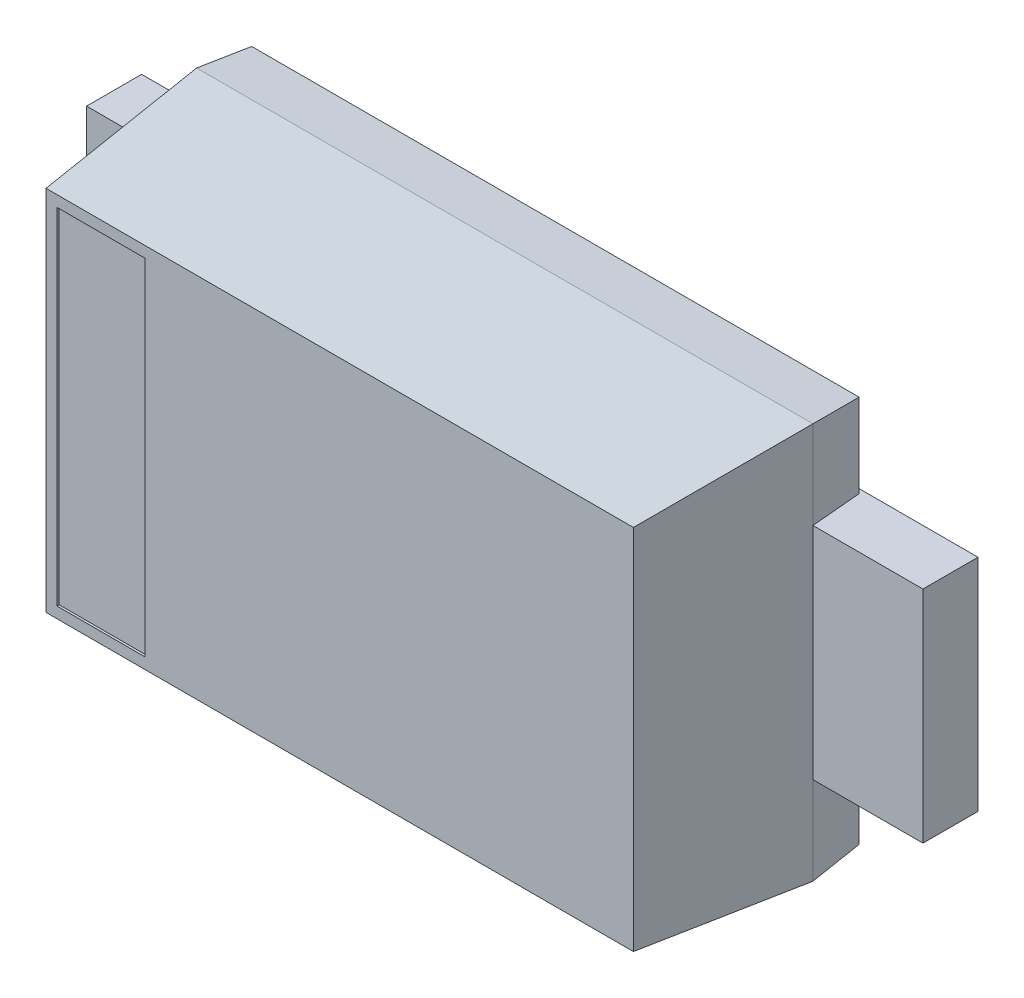
ISO-10303-21;
HEADER;
FILE_DESCRIPTION(('STEP AP214'),'2;1');
FILE_NAME('part.step','',(''),(''),'','','');
FILE_SCHEMA(('AUTOMOTIVE_DESIGN { 1 0 10303 214 1 1 1 1 }'));
ENDSEC;
DATA;
#1=APPLICATION_CONTEXT('core data for automotive mechanical design processes');
#2=APPLICATION_PROTOCOL_DEFINITION('international standard','automotive_design',2000,#1);
#3=PRODUCT_CONTEXT('',#1,'mechanical');
#4=PRODUCT('Part','Part','',(#3));
#5=PRODUCT_RELATED_PRODUCT_CATEGORY('part','',(#4));
#6=PRODUCT_DEFINITION_FORMATION('','',#4);
#7=PRODUCT_DEFINITION_CONTEXT('part definition',#1,'design');
#8=PRODUCT_DEFINITION('design','',#6,#7);
#9=PRODUCT_DEFINITION_SHAPE('','',#8);
#10=(LENGTH_UNIT() NAMED_UNIT(*) SI_UNIT(.MILLI.,.METRE.));
#11=(NAMED_UNIT(*) PLANE_ANGLE_UNIT() SI_UNIT($,.RADIAN.));
#12=(NAMED_UNIT(*) SI_UNIT($,.STERADIAN.) SOLID_ANGLE_UNIT());
#13=UNCERTAINTY_MEASURE_WITH_UNIT(LENGTH_MEASURE(1.E-05),#10,'distance_accuracy_value','');
#14=(GEOMETRIC_REPRESENTATION_CONTEXT(3) GLOBAL_UNCERTAINTY_ASSIGNED_CONTEXT((#13)) GLOBAL_UNIT_ASSIGNED_CONTEXT((#10,
#11,#12)) REPRESENTATION_CONTEXT('',''));
#15=CARTESIAN_POINT('',(0.,0.,0.));
#16=DIRECTION('',(0.,0.,1.));
#17=DIRECTION('',(1.,0.,0.));
#18=AXIS2_PLACEMENT_3D('',#15,#16,#17);
#19=CARTESIAN_POINT('',(-1.284383502356,-0.784383502356,0.99));
#20=DIRECTION('',(0.,0.,1.));
#21=DIRECTION('',(1.,0.,0.));
#22=AXIS2_PLACEMENT_3D('',#19,#20,#21);
#23=PLANE('',#22);
#24=DIRECTION('',(0.,1.,0.));
#25=VECTOR('',#24,1.);
#26=CARTESIAN_POINT('',(-0.884383502356,-0.784383502356,0.99));
#27=LINE('',#26,#25);
#28=CARTESIAN_POINT('',(-0.884383502356,-0.784383502356,0.99));
#29=VERTEX_POINT('',#28);
#30=CARTESIAN_POINT('',(-0.884383502356,0.784383502356,0.99));
#31=VERTEX_POINT('',#30);
#32=EDGE_CURVE('E342',#29,#31,#27,.T.);
#33=ORIENTED_EDGE('',*,*,#32,.T.);
#34=DIRECTION('',(1.,0.,0.));
#35=VECTOR('',#34,1.);
#36=CARTESIAN_POINT('',(-1.284383502356,0.784383502356,0.99));
#37=LINE('',#36,#35);
#38=CARTESIAN_POINT('',(-1.284383502356,0.784383502356,0.99));
#39=VERTEX_POINT('',#38);
#40=EDGE_CURVE('E359',#31,#39,#37,.F.);
#41=ORIENTED_EDGE('',*,*,#40,.T.);
#42=DIRECTION('',(0.,1.,0.));
#43=VECTOR('',#42,1.);
#44=CARTESIAN_POINT('',(-1.284383502356,-0.784383502356,0.99));
#45=LINE('',#44,#43);
#46=CARTESIAN_POINT('',(-1.284383502356,-0.784383502356,0.99));
#47=VERTEX_POINT('',#46);
#48=EDGE_CURVE('E356',#47,#39,#45,.T.);
#49=ORIENTED_EDGE('',*,*,#48,.F.);
#50=DIRECTION('',(1.,0.,0.));
#51=VECTOR('',#50,1.);
#52=CARTESIAN_POINT('',(-1.284383502356,-0.784383502356,0.99));
#53=LINE('',#52,#51);
#54=EDGE_CURVE('E350',#29,#47,#53,.F.);
#55=ORIENTED_EDGE('',*,*,#54,.F.);
#56=EDGE_LOOP('',(#33,#41,#49,#55));
#57=FACE_BOUND('',#56,.T.);
#58=ADVANCED_FACE('F18',(#57),#23,.T.);
#59=CARTESIAN_POINT('',(-1.284383502356,0.784383502356,0.99));
#60=DIRECTION('',(0.,1.,0.));
#61=DIRECTION('',(0.,0.,1.));
#62=AXIS2_PLACEMENT_3D('',#59,#60,#61);
#63=PLANE('',#62);
#64=DIRECTION('',(0.,0.,-1.));
#65=VECTOR('',#64,1.);
#66=CARTESIAN_POINT('',(-1.284383502356,0.784383502356,0.99));
#67=LINE('',#66,#65);
#68=CARTESIAN_POINT('',(-1.284383502356,0.784383502356,1.));
#69=VERTEX_POINT('',#68);
#70=EDGE_CURVE('E353',#39,#69,#67,.F.);
#71=ORIENTED_EDGE('',*,*,#70,.F.);
#72=ORIENTED_EDGE('',*,*,#40,.F.);
#73=DIRECTION('',(0.,0.,-1.));
#74=VECTOR('',#73,1.);
#75=CARTESIAN_POINT('',(-0.884383502356,0.784383502356,0.99));
#76=LINE('',#75,#74);
#77=CARTESIAN_POINT('',(-0.884383502356,0.784383502356,1.));
#78=VERTEX_POINT('',#77);
#79=EDGE_CURVE('E311',#31,#78,#76,.F.);
#80=ORIENTED_EDGE('',*,*,#79,.T.);
#81=DIRECTION('',(-1.,0.,0.));
#82=VECTOR('',#81,1.);
#83=CARTESIAN_POINT('',(-1.334383502356,0.784383502356,1.));
#84=LINE('',#83,#82);
#85=EDGE_CURVE('E303',#78,#69,#84,.T.);
#86=ORIENTED_EDGE('',*,*,#85,.T.);
#87=EDGE_LOOP('',(#71,#72,#80,#86));
#88=FACE_BOUND('',#87,.T.);
#89=ADVANCED_FACE('F367',(#88),#63,.F.);
#90=CARTESIAN_POINT('',(-1.284383502356,-0.784383502356,0.99));
#91=DIRECTION('',(1.,0.,0.));
#92=DIRECTION('',(0.,0.,-1.));
#93=AXIS2_PLACEMENT_3D('',#90,#91,#92);
#94=PLANE('',#93);
#95=ORIENTED_EDGE('',*,*,#70,.T.);
#96=DIRECTION('',(0.,1.,0.));
#97=VECTOR('',#96,1.);
#98=CARTESIAN_POINT('',(-1.284383502356,-0.834383502356,1.));
#99=LINE('',#98,#97);
#100=CARTESIAN_POINT('',(-1.284383502356,-0.784383502356,1.));
#101=VERTEX_POINT('',#100);
#102=EDGE_CURVE('E301',#69,#101,#99,.F.);
#103=ORIENTED_EDGE('',*,*,#102,.T.);
#104=DIRECTION('',(0.,0.,1.));
#105=VECTOR('',#104,1.);
#106=CARTESIAN_POINT('',(-1.284383502356,-0.784383502356,0.99));
#107=LINE('',#106,#105);
#108=EDGE_CURVE('E347',#47,#101,#107,.T.);
#109=ORIENTED_EDGE('',*,*,#108,.F.);
#110=ORIENTED_EDGE('',*,*,#48,.T.);
#111=EDGE_LOOP('',(#95,#103,#109,#110));
#112=FACE_BOUND('',#111,.T.);
#113=ADVANCED_FACE('F371',(#112),#94,.T.);
#114=CARTESIAN_POINT('',(-1.284383502356,-0.784383502356,0.99));
#115=DIRECTION('',(0.,1.,0.));
#116=DIRECTION('',(0.,0.,1.));
#117=AXIS2_PLACEMENT_3D('',#114,#115,#116);
#118=PLANE('',#117);
#119=ORIENTED_EDGE('',*,*,#108,.T.);
#120=DIRECTION('',(-1.,0.,0.));
#121=VECTOR('',#120,1.);
#122=CARTESIAN_POINT('',(-1.334383502356,-0.784383502356,1.));
#123=LINE('',#122,#121);
#124=CARTESIAN_POINT('',(-0.884383502356,-0.784383502356,1.));
#125=VERTEX_POINT('',#124);
#126=EDGE_CURVE('E299',#101,#125,#123,.F.);
#127=ORIENTED_EDGE('',*,*,#126,.T.);
#128=DIRECTION('',(0.,0.,-1.));
#129=VECTOR('',#128,1.);
#130=CARTESIAN_POINT('',(-0.884383502356,-0.784383502356,0.99));
#131=LINE('',#130,#129);
#132=EDGE_CURVE('E344',#125,#29,#131,.T.);
#133=ORIENTED_EDGE('',*,*,#132,.T.);
#134=ORIENTED_EDGE('',*,*,#54,.T.);
#135=EDGE_LOOP('',(#119,#127,#133,#134));
#136=FACE_BOUND('',#135,.T.);
#137=ADVANCED_FACE('F374',(#136),#118,.T.);
#138=CARTESIAN_POINT('',(-0.884383502356,-0.784383502356,0.99));
#139=DIRECTION('',(1.,0.,0.));
#140=DIRECTION('',(0.,0.,-1.));
#141=AXIS2_PLACEMENT_3D('',#138,#139,#140);
#142=PLANE('',#141);
#143=ORIENTED_EDGE('',*,*,#79,.F.);
#144=ORIENTED_EDGE('',*,*,#32,.F.);
#145=ORIENTED_EDGE('',*,*,#132,.F.);
#146=DIRECTION('',(0.,1.,0.));
#147=VECTOR('',#146,1.);
#148=CARTESIAN_POINT('',(-0.884383502356,-0.834383502356,1.));
#149=LINE('',#148,#147);
#150=EDGE_CURVE('E290',#125,#78,#149,.T.);
#151=ORIENTED_EDGE('',*,*,#150,.T.);
#152=EDGE_LOOP('',(#143,#144,#145,#151));
#153=FACE_BOUND('',#152,.T.);
#154=ADVANCED_FACE('F378',(#153),#142,.F.);
#155=CARTESIAN_POINT('',(-1.4,0.9,0.25));
#156=DIRECTION('',(-0.996194698091797,0.,0.0871557427470741));
#157=DIRECTION('',(0.,-1.,0.));
#158=AXIS2_PLACEMENT_3D('',#155,#156,#157);
#159=PLANE('',#158);
#160=DIRECTION('',(0.,1.,0.));
#161=VECTOR('',#160,1.);
#162=CARTESIAN_POINT('',(-1.334383502356,-0.834383502356,1.));
#163=LINE('',#162,#161);
#164=CARTESIAN_POINT('',(-1.334383502356,-0.834383502356,1.));
#165=VERTEX_POINT('',#164);
#166=CARTESIAN_POINT('',(-1.334383502356,0.834383502356,1.));
#167=VERTEX_POINT('',#166);
#168=EDGE_CURVE('E216',#165,#167,#163,.T.);
#169=ORIENTED_EDGE('',*,*,#168,.T.);
#170=DIRECTION('',(-0.0868265938636701,0.0868265938636702,-0.992432509139068));
#171=VECTOR('',#170,1.);
#172=CARTESIAN_POINT('',(-1.367191751178,0.867191751178,0.625));
#173=LINE('',#172,#171);
#174=CARTESIAN_POINT('',(-1.4,0.9,0.25));
#175=VERTEX_POINT('',#174);
#176=EDGE_CURVE('E175',#167,#175,#173,.T.);
#177=ORIENTED_EDGE('',*,*,#176,.T.);
#178=DIRECTION('',(0.,-1.,0.));
#179=VECTOR('',#178,1.);
#180=CARTESIAN_POINT('',(-1.4,0.,0.25));
#181=LINE('',#180,#179);
#182=CARTESIAN_POINT('',(-1.4,0.5,0.25));
#183=VERTEX_POINT('',#182);
#184=EDGE_CURVE('E176',#175,#183,#181,.T.);
#185=ORIENTED_EDGE('',*,*,#184,.T.);
#186=DIRECTION('',(0.,1.,0.));
#187=VECTOR('',#186,1.);
#188=CARTESIAN_POINT('',(-1.4,0.5,0.25));
#189=LINE('',#188,#187);
#190=CARTESIAN_POINT('',(-1.4,-0.5,0.25));
#191=VERTEX_POINT('',#190);
#192=EDGE_CURVE('E173',#191,#183,#189,.T.);
#193=ORIENTED_EDGE('',*,*,#192,.F.);
#194=DIRECTION('',(0.,-1.,0.));
#195=VECTOR('',#194,1.);
#196=CARTESIAN_POINT('',(-1.4,0.,0.25));
#197=LINE('',#196,#195);
#198=CARTESIAN_POINT('',(-1.4,-0.9,0.25));
#199=VERTEX_POINT('',#198);
#200=EDGE_CURVE('E166',#191,#199,#197,.T.);
#201=ORIENTED_EDGE('',*,*,#200,.T.);
#202=DIRECTION('',(-0.0868265938636701,-0.0868265938636702,-0.992432509139068));
#203=VECTOR('',#202,1.);
#204=CARTESIAN_POINT('',(-1.367191751178,-0.867191751178,0.625));
#205=LINE('',#204,#203);
#206=EDGE_CURVE('E170',#165,#199,#205,.T.);
#207=ORIENTED_EDGE('',*,*,#206,.F.);
#208=EDGE_LOOP('',(#169,#177,#185,#193,#201,#207));
#209=FACE_BOUND('',#208,.T.);
#210=ADVANCED_FACE('F169',(#209),#159,.T.);
#211=CARTESIAN_POINT('',(-1.334383502356,-0.834383502356,1.));
#212=DIRECTION('',(0.,0.,-1.));
#213=DIRECTION('',(-1.,0.,0.));
#214=AXIS2_PLACEMENT_3D('',#211,#212,#213);
#215=PLANE('',#214);
#216=ORIENTED_EDGE('',*,*,#126,.F.);
#217=ORIENTED_EDGE('',*,*,#102,.F.);
#218=ORIENTED_EDGE('',*,*,#85,.F.);
#219=ORIENTED_EDGE('',*,*,#150,.F.);
#220=EDGE_LOOP('',(#216,#217,#218,#219));
#221=FACE_BOUND('',#220,.T.);
#222=DIRECTION('',(1.,0.,0.));
#223=VECTOR('',#222,1.);
#224=CARTESIAN_POINT('',(0.,0.834383502356,1.));
#225=LINE('',#224,#223);
#226=CARTESIAN_POINT('',(1.334383502356,0.834383502356,1.));
#227=VERTEX_POINT('',#226);
#228=EDGE_CURVE('E249',#167,#227,#225,.T.);
#229=ORIENTED_EDGE('',*,*,#228,.F.);
#230=ORIENTED_EDGE('',*,*,#168,.F.);
#231=DIRECTION('',(-1.,0.,0.));
#232=VECTOR('',#231,1.);
#233=CARTESIAN_POINT('',(0.,-0.834383502356,1.));
#234=LINE('',#233,#232);
#235=CARTESIAN_POINT('',(1.334383502356,-0.834383502356,1.));
#236=VERTEX_POINT('',#235);
#237=EDGE_CURVE('E185',#236,#165,#234,.T.);
#238=ORIENTED_EDGE('',*,*,#237,.F.);
#239=DIRECTION('',(0.,-1.,0.));
#240=VECTOR('',#239,1.);
#241=CARTESIAN_POINT('',(1.334383502356,0.,1.));
#242=LINE('',#241,#240);
#243=EDGE_CURVE('E282',#227,#236,#242,.T.);
#244=ORIENTED_EDGE('',*,*,#243,.F.);
#245=EDGE_LOOP('',(#229,#230,#238,#244));
#246=FACE_BOUND('',#245,.T.);
#247=ADVANCED_FACE('F380',(#221,#246),#215,.F.);
#248=CARTESIAN_POINT('',(1.4,-0.9,0.25));
#249=DIRECTION('',(0.996194698091797,0.,0.0871557427470741));
#250=DIRECTION('',(0.,1.,0.));
#251=AXIS2_PLACEMENT_3D('',#248,#249,#250);
#252=PLANE('',#251);
#253=ORIENTED_EDGE('',*,*,#243,.T.);
#254=DIRECTION('',(-0.0868265938636701,0.0868265938636702,0.992432509139068));
#255=VECTOR('',#254,1.);
#256=CARTESIAN_POINT('',(1.367191751178,-0.867191751178,0.625));
#257=LINE('',#256,#255);
#258=CARTESIAN_POINT('',(1.4,-0.9,0.25));
#259=VERTEX_POINT('',#258);
#260=EDGE_CURVE('E275',#259,#236,#257,.T.);
#261=ORIENTED_EDGE('',*,*,#260,.F.);
#262=DIRECTION('',(0.,1.,0.));
#263=VECTOR('',#262,1.);
#264=CARTESIAN_POINT('',(1.4,0.,0.25));
#265=LINE('',#264,#263);
#266=CARTESIAN_POINT('',(1.4,-0.5,0.25));
#267=VERTEX_POINT('',#266);
#268=EDGE_CURVE('E286',#259,#267,#265,.T.);
#269=ORIENTED_EDGE('',*,*,#268,.T.);
#270=DIRECTION('',(0.,1.,0.));
#271=VECTOR('',#270,1.);
#272=CARTESIAN_POINT('',(1.4,-0.5,0.25));
#273=LINE('',#272,#271);
#274=CARTESIAN_POINT('',(1.4,0.5,0.25));
#275=VERTEX_POINT('',#274);
#276=EDGE_CURVE('E426',#275,#267,#273,.F.);
#277=ORIENTED_EDGE('',*,*,#276,.F.);
#278=DIRECTION('',(0.,1.,0.));
#279=VECTOR('',#278,1.);
#280=CARTESIAN_POINT('',(1.4,0.,0.25));
#281=LINE('',#280,#279);
#282=CARTESIAN_POINT('',(1.4,0.9,0.25));
#283=VERTEX_POINT('',#282);
#284=EDGE_CURVE('E284',#275,#283,#281,.T.);
#285=ORIENTED_EDGE('',*,*,#284,.T.);
#286=DIRECTION('',(0.0868265938636701,0.0868265938636702,-0.992432509139068));
#287=VECTOR('',#286,1.);
#288=CARTESIAN_POINT('',(1.367191751178,0.867191751178,0.625));
#289=LINE('',#288,#287);
#290=EDGE_CURVE('E318',#227,#283,#289,.T.);
#291=ORIENTED_EDGE('',*,*,#290,.F.);
#292=EDGE_LOOP('',(#253,#261,#269,#277,#285,#291));
#293=FACE_BOUND('',#292,.T.);
#294=ADVANCED_FACE('F383',(#293),#252,.T.);
#295=CARTESIAN_POINT('',(-1.4,-0.9,0.25));
#296=DIRECTION('',(0.,-0.996194698091797,0.0871557427470742));
#297=DIRECTION('',(1.,0.,0.));
#298=AXIS2_PLACEMENT_3D('',#295,#296,#297);
#299=PLANE('',#298);
#300=ORIENTED_EDGE('',*,*,#237,.T.);
#301=ORIENTED_EDGE('',*,*,#206,.T.);
#302=DIRECTION('',(-1.,0.,0.));
#303=VECTOR('',#302,1.);
#304=CARTESIAN_POINT('',(0.,-0.9,0.25));
#305=LINE('',#304,#303);
#306=EDGE_CURVE('E182',#259,#199,#305,.T.);
#307=ORIENTED_EDGE('',*,*,#306,.F.);
#308=ORIENTED_EDGE('',*,*,#260,.T.);
#309=EDGE_LOOP('',(#300,#301,#307,#308));
#310=FACE_BOUND('',#309,.T.);
#311=ADVANCED_FACE('F180',(#310),#299,.T.);
#312=CARTESIAN_POINT('',(-1.9,0.5,0.));
#313=DIRECTION('',(-1.,0.,0.));
#314=DIRECTION('',(0.,-1.,0.));
#315=AXIS2_PLACEMENT_3D('',#312,#313,#314);
#316=PLANE('',#315);
#317=DIRECTION('',(0.,0.,1.));
#318=VECTOR('',#317,1.);
#319=CARTESIAN_POINT('',(-1.9,-0.5,0.));
#320=LINE('',#319,#318);
#321=CARTESIAN_POINT('',(-1.9,-0.5,0.25));
#322=VERTEX_POINT('',#321);
#323=CARTESIAN_POINT('',(-1.9,-0.5,0.));
#324=VERTEX_POINT('',#323);
#325=EDGE_CURVE('E197',#322,#324,#320,.F.);
#326=ORIENTED_EDGE('',*,*,#325,.F.);
#327=DIRECTION('',(0.,1.,0.));
#328=VECTOR('',#327,1.);
#329=CARTESIAN_POINT('',(-1.9,0.5,0.25));
#330=LINE('',#329,#328);
#331=CARTESIAN_POINT('',(-1.9,0.5,0.25));
#332=VERTEX_POINT('',#331);
#333=EDGE_CURVE('E247',#332,#322,#330,.F.);
#334=ORIENTED_EDGE('',*,*,#333,.F.);
#335=DIRECTION('',(0.,0.,1.));
#336=VECTOR('',#335,1.);
#337=CARTESIAN_POINT('',(-1.9,0.5,0.));
#338=LINE('',#337,#336);
#339=CARTESIAN_POINT('',(-1.9,0.5,0.));
#340=VERTEX_POINT('',#339);
#341=EDGE_CURVE('E252',#332,#340,#338,.F.);
#342=ORIENTED_EDGE('',*,*,#341,.T.);
#343=DIRECTION('',(0.,1.,0.));
#344=VECTOR('',#343,1.);
#345=CARTESIAN_POINT('',(-1.9,0.5,0.));
#346=LINE('',#345,#344);
#347=EDGE_CURVE('E186',#340,#324,#346,.F.);
#348=ORIENTED_EDGE('',*,*,#347,.T.);
#349=EDGE_LOOP('',(#326,#334,#342,#348));
#350=FACE_BOUND('',#349,.T.);
#351=ADVANCED_FACE('F535',(#350),#316,.T.);
#352=CARTESIAN_POINT('',(-1.3,0.5,0.));
#353=DIRECTION('',(0.,0.,1.));
#354=DIRECTION('',(1.,0.,0.));
#355=AXIS2_PLACEMENT_3D('',#352,#353,#354);
#356=PLANE('',#355);
#357=ORIENTED_EDGE('',*,*,#347,.F.);
#358=DIRECTION('',(1.,0.,0.));
#359=VECTOR('',#358,1.);
#360=CARTESIAN_POINT('',(-1.3,0.5,0.));
#361=LINE('',#360,#359);
#362=CARTESIAN_POINT('',(-1.3,0.5,0.));
#363=VERTEX_POINT('',#362);
#364=EDGE_CURVE('E238',#340,#363,#361,.T.);
#365=ORIENTED_EDGE('',*,*,#364,.T.);
#366=DIRECTION('',(0.,-1.,0.));
#367=VECTOR('',#366,1.);
#368=CARTESIAN_POINT('',(-1.3,0.5,0.));
#369=LINE('',#368,#367);
#370=CARTESIAN_POINT('',(-1.3,-0.5,0.));
#371=VERTEX_POINT('',#370);
#372=EDGE_CURVE('E271',#363,#371,#369,.T.);
#373=ORIENTED_EDGE('',*,*,#372,.T.);
#374=DIRECTION('',(1.,0.,0.));
#375=VECTOR('',#374,1.);
#376=CARTESIAN_POINT('',(-1.3,-0.5,0.));
#377=LINE('',#376,#375);
#378=EDGE_CURVE('E200',#324,#371,#377,.T.);
#379=ORIENTED_EDGE('',*,*,#378,.F.);
#380=EDGE_LOOP('',(#357,#365,#373,#379));
#381=FACE_BOUND('',#380,.T.);
#382=ADVANCED_FACE('F532',(#381),#356,.F.);
#383=CARTESIAN_POINT('',(-1.3,0.5,0.25));
#384=DIRECTION('',(0.,0.,1.));
#385=DIRECTION('',(1.,0.,0.));
#386=AXIS2_PLACEMENT_3D('',#383,#384,#385);
#387=PLANE('',#386);
#388=ORIENTED_EDGE('',*,*,#333,.T.);
#389=DIRECTION('',(1.,0.,0.));
#390=VECTOR('',#389,1.);
#391=CARTESIAN_POINT('',(-1.3,-0.5,0.25));
#392=LINE('',#391,#390);
#393=EDGE_CURVE('E268',#191,#322,#392,.F.);
#394=ORIENTED_EDGE('',*,*,#393,.F.);
#395=ORIENTED_EDGE('',*,*,#192,.T.);
#396=DIRECTION('',(1.,0.,0.));
#397=VECTOR('',#396,1.);
#398=CARTESIAN_POINT('',(-1.3,0.5,0.25));
#399=LINE('',#398,#397);
#400=EDGE_CURVE('E226',#183,#332,#399,.F.);
#401=ORIENTED_EDGE('',*,*,#400,.T.);
#402=EDGE_LOOP('',(#388,#394,#395,#401));
#403=FACE_BOUND('',#402,.T.);
#404=ADVANCED_FACE('F529',(#403),#387,.T.);
#405=CARTESIAN_POINT('',(1.4,0.9,0.25));
#406=DIRECTION('',(0.,0.996194698091797,0.0871557427470742));
#407=DIRECTION('',(-1.,0.,0.));
#408=AXIS2_PLACEMENT_3D('',#405,#406,#407);
#409=PLANE('',#408);
#410=ORIENTED_EDGE('',*,*,#228,.T.);
#411=ORIENTED_EDGE('',*,*,#290,.T.);
#412=DIRECTION('',(1.,0.,0.));
#413=VECTOR('',#412,1.);
#414=CARTESIAN_POINT('',(0.,0.9,0.25));
#415=LINE('',#414,#413);
#416=EDGE_CURVE('E210',#175,#283,#415,.T.);
#417=ORIENTED_EDGE('',*,*,#416,.F.);
#418=ORIENTED_EDGE('',*,*,#176,.F.);
#419=EDGE_LOOP('',(#410,#411,#417,#418));
#420=FACE_BOUND('',#419,.T.);
#421=ADVANCED_FACE('F528',(#420),#409,.T.);
#422=CARTESIAN_POINT('',(1.9,-0.5,0.));
#423=DIRECTION('',(1.,0.,0.));
#424=DIRECTION('',(0.,1.,0.));
#425=AXIS2_PLACEMENT_3D('',#422,#423,#424);
#426=PLANE('',#425);
#427=DIRECTION('',(0.,0.,1.));
#428=VECTOR('',#427,1.);
#429=CARTESIAN_POINT('',(1.9,0.5,0.));
#430=LINE('',#429,#428);
#431=CARTESIAN_POINT('',(1.9,0.5,0.25));
#432=VERTEX_POINT('',#431);
#433=CARTESIAN_POINT('',(1.9,0.5,0.));
#434=VERTEX_POINT('',#433);
#435=EDGE_CURVE('E276',#432,#434,#430,.F.);
#436=ORIENTED_EDGE('',*,*,#435,.F.);
#437=DIRECTION('',(0.,1.,0.));
#438=VECTOR('',#437,1.);
#439=CARTESIAN_POINT('',(1.9,-0.5,0.25));
#440=LINE('',#439,#438);
#441=CARTESIAN_POINT('',(1.9,-0.5,0.25));
#442=VERTEX_POINT('',#441);
#443=EDGE_CURVE('E191',#442,#432,#440,.T.);
#444=ORIENTED_EDGE('',*,*,#443,.F.);
#445=DIRECTION('',(0.,0.,1.));
#446=VECTOR('',#445,1.);
#447=CARTESIAN_POINT('',(1.9,-0.5,0.));
#448=LINE('',#447,#446);
#449=CARTESIAN_POINT('',(1.9,-0.5,0.));
#450=VERTEX_POINT('',#449);
#451=EDGE_CURVE('E414',#442,#450,#448,.F.);
#452=ORIENTED_EDGE('',*,*,#451,.T.);
#453=DIRECTION('',(0.,1.,0.));
#454=VECTOR('',#453,1.);
#455=CARTESIAN_POINT('',(1.9,-0.5,0.));
#456=LINE('',#455,#454);
#457=EDGE_CURVE('E321',#450,#434,#456,.T.);
#458=ORIENTED_EDGE('',*,*,#457,.T.);
#459=EDGE_LOOP('',(#436,#444,#452,#458));
#460=FACE_BOUND('',#459,.T.);
#461=ADVANCED_FACE('F456',(#460),#426,.T.);
#462=CARTESIAN_POINT('',(1.3,-0.5,0.));
#463=DIRECTION('',(0.,0.,1.));
#464=DIRECTION('',(1.,0.,0.));
#465=AXIS2_PLACEMENT_3D('',#462,#463,#464);
#466=PLANE('',#465);
#467=ORIENTED_EDGE('',*,*,#457,.F.);
#468=DIRECTION('',(-1.,0.,0.));
#469=VECTOR('',#468,1.);
#470=CARTESIAN_POINT('',(1.3,-0.5,0.));
#471=LINE('',#470,#469);
#472=CARTESIAN_POINT('',(1.3,-0.5,0.));
#473=VERTEX_POINT('',#472);
#474=EDGE_CURVE('E410',#450,#473,#471,.T.);
#475=ORIENTED_EDGE('',*,*,#474,.T.);
#476=DIRECTION('',(0.,1.,0.));
#477=VECTOR('',#476,1.);
#478=CARTESIAN_POINT('',(1.3,-0.5,0.));
#479=LINE('',#478,#477);
#480=CARTESIAN_POINT('',(1.3,0.5,0.));
#481=VERTEX_POINT('',#480);
#482=EDGE_CURVE('E415',#473,#481,#479,.T.);
#483=ORIENTED_EDGE('',*,*,#482,.T.);
#484=DIRECTION('',(-1.,0.,0.));
#485=VECTOR('',#484,1.);
#486=CARTESIAN_POINT('',(1.3,0.5,0.));
#487=LINE('',#486,#485);
#488=EDGE_CURVE('E224',#434,#481,#487,.T.);
#489=ORIENTED_EDGE('',*,*,#488,.F.);
#490=EDGE_LOOP('',(#467,#475,#483,#489));
#491=FACE_BOUND('',#490,.T.);
#492=ADVANCED_FACE('F461',(#491),#466,.F.);
#493=CARTESIAN_POINT('',(1.3,-0.5,0.25));
#494=DIRECTION('',(0.,0.,1.));
#495=DIRECTION('',(1.,0.,0.));
#496=AXIS2_PLACEMENT_3D('',#493,#494,#495);
#497=PLANE('',#496);
#498=ORIENTED_EDGE('',*,*,#443,.T.);
#499=DIRECTION('',(-1.,0.,0.));
#500=VECTOR('',#499,1.);
#501=CARTESIAN_POINT('',(1.3,0.5,0.25));
#502=LINE('',#501,#500);
#503=EDGE_CURVE('E223',#275,#432,#502,.F.);
#504=ORIENTED_EDGE('',*,*,#503,.F.);
#505=ORIENTED_EDGE('',*,*,#276,.T.);
#506=DIRECTION('',(-1.,0.,0.));
#507=VECTOR('',#506,1.);
#508=CARTESIAN_POINT('',(1.3,-0.5,0.25));
#509=LINE('',#508,#507);
#510=EDGE_CURVE('E338',#267,#442,#509,.F.);
#511=ORIENTED_EDGE('',*,*,#510,.T.);
#512=EDGE_LOOP('',(#498,#504,#505,#511));
#513=FACE_BOUND('',#512,.T.);
#514=ADVANCED_FACE('F452',(#513),#497,.T.);
#515=CARTESIAN_POINT('',(-1.379877607389,-0.879877607389,0.02));
#516=DIRECTION('',(0.,-0.996194698091731,-0.0871557427478195));
#517=DIRECTION('',(1.,0.,0.));
#518=AXIS2_PLACEMENT_3D('',#515,#516,#517);
#519=PLANE('',#518);
#520=ORIENTED_EDGE('',*,*,#306,.T.);
#521=DIRECTION('',(-0.0868265938644066,-0.0868265938644071,0.992432509138939));
#522=VECTOR('',#521,1.);
#523=CARTESIAN_POINT('',(-1.3899388036945,-0.8899388036945,0.135));
#524=LINE('',#523,#522);
#525=CARTESIAN_POINT('',(-1.379877607389,-0.879877607389,0.02));
#526=VERTEX_POINT('',#525);
#527=EDGE_CURVE('E86',#526,#199,#524,.T.);
#528=ORIENTED_EDGE('',*,*,#527,.F.);
#529=DIRECTION('',(-1.,0.,0.));
#530=VECTOR('',#529,1.);
#531=CARTESIAN_POINT('',(-1.379877607389,-0.879877607389,0.02));
#532=LINE('',#531,#530);
#533=CARTESIAN_POINT('',(1.379877607389,-0.879877607389,0.02));
#534=VERTEX_POINT('',#533);
#535=EDGE_CURVE('E220',#534,#526,#532,.T.);
#536=ORIENTED_EDGE('',*,*,#535,.F.);
#537=DIRECTION('',(-0.0868265938644066,0.0868265938644071,-0.992432509138939));
#538=VECTOR('',#537,1.);
#539=CARTESIAN_POINT('',(1.3899388036945,-0.8899388036945,0.135));
#540=LINE('',#539,#538);
#541=EDGE_CURVE('E190',#259,#534,#540,.T.);
#542=ORIENTED_EDGE('',*,*,#541,.F.);
#543=EDGE_LOOP('',(#520,#528,#536,#542));
#544=FACE_BOUND('',#543,.T.);
#545=ADVANCED_FACE('F188',(#544),#519,.T.);
#546=CARTESIAN_POINT('',(-1.379877607389,0.879877607389,0.02));
#547=DIRECTION('',(-0.996194698091731,0.,-0.087155742747819));
#548=DIRECTION('',(0.,-1.,0.));
#549=AXIS2_PLACEMENT_3D('',#546,#547,#548);
#550=PLANE('',#549);
#551=ORIENTED_EDGE('',*,*,#527,.T.);
#552=ORIENTED_EDGE('',*,*,#200,.F.);
#553=DIRECTION('',(-0.087155742747819,0.,0.996194698091731));
#554=VECTOR('',#553,1.);
#555=CARTESIAN_POINT('',(-1.379877607389,-0.5,0.02));
#556=LINE('',#555,#554);
#557=CARTESIAN_POINT('',(-1.379877607389,-0.5,0.02));
#558=VERTEX_POINT('',#557);
#559=EDGE_CURVE('E22',#558,#191,#556,.T.);
#560=ORIENTED_EDGE('',*,*,#559,.F.);
#561=DIRECTION('',(0.,1.,0.));
#562=VECTOR('',#561,1.);
#563=CARTESIAN_POINT('',(-1.379877607389,-0.879877607389,0.02));
#564=LINE('',#563,#562);
#565=EDGE_CURVE('E195',#526,#558,#564,.T.);
#566=ORIENTED_EDGE('',*,*,#565,.F.);
#567=EDGE_LOOP('',(#551,#552,#560,#566));
#568=FACE_BOUND('',#567,.T.);
#569=ADVANCED_FACE('F193',(#568),#550,.T.);
#570=CARTESIAN_POINT('',(-1.3,-0.5,0.));
#571=DIRECTION('',(0.,-1.,0.));
#572=DIRECTION('',(1.,0.,0.));
#573=AXIS2_PLACEMENT_3D('',#570,#571,#572);
#574=PLANE('',#573);
#575=ORIENTED_EDGE('',*,*,#559,.T.);
#576=ORIENTED_EDGE('',*,*,#393,.T.);
#577=ORIENTED_EDGE('',*,*,#325,.T.);
#578=ORIENTED_EDGE('',*,*,#378,.T.);
#579=DIRECTION('',(0.,0.,1.));
#580=VECTOR('',#579,1.);
#581=CARTESIAN_POINT('',(-1.3,-0.5,0.));
#582=LINE('',#581,#580);
#583=CARTESIAN_POINT('',(-1.3,-0.5,0.02));
#584=VERTEX_POINT('',#583);
#585=EDGE_CURVE('E254',#371,#584,#582,.T.);
#586=ORIENTED_EDGE('',*,*,#585,.T.);
#587=DIRECTION('',(-1.,0.,0.));
#588=VECTOR('',#587,1.);
#589=CARTESIAN_POINT('',(-1.379877607389,-0.5,0.02));
#590=LINE('',#589,#588);
#591=EDGE_CURVE('E263',#558,#584,#590,.F.);
#592=ORIENTED_EDGE('',*,*,#591,.F.);
#593=EDGE_LOOP('',(#575,#576,#577,#578,#586,#592));
#594=FACE_BOUND('',#593,.T.);
#595=ADVANCED_FACE('F518',(#594),#574,.T.);
#596=CARTESIAN_POINT('',(-1.3,0.5,0.));
#597=DIRECTION('',(-1.,0.,0.));
#598=DIRECTION('',(0.,-1.,0.));
#599=AXIS2_PLACEMENT_3D('',#596,#597,#598);
#600=PLANE('',#599);
#601=ORIENTED_EDGE('',*,*,#585,.F.);
#602=ORIENTED_EDGE('',*,*,#372,.F.);
#603=DIRECTION('',(0.,0.,1.));
#604=VECTOR('',#603,1.);
#605=CARTESIAN_POINT('',(-1.3,0.5,0.));
#606=LINE('',#605,#604);
#607=CARTESIAN_POINT('',(-1.3,0.5,0.02));
#608=VERTEX_POINT('',#607);
#609=EDGE_CURVE('E231',#363,#608,#606,.T.);
#610=ORIENTED_EDGE('',*,*,#609,.T.);
#611=DIRECTION('',(0.,1.,0.));
#612=VECTOR('',#611,1.);
#613=CARTESIAN_POINT('',(-1.3,-0.879877607389,0.02));
#614=LINE('',#613,#612);
#615=EDGE_CURVE('E266',#584,#608,#614,.T.);
#616=ORIENTED_EDGE('',*,*,#615,.F.);
#617=EDGE_LOOP('',(#601,#602,#610,#616));
#618=FACE_BOUND('',#617,.T.);
#619=ADVANCED_FACE('F485',(#618),#600,.F.);
#620=CARTESIAN_POINT('',(-1.3,0.5,0.));
#621=DIRECTION('',(0.,-1.,0.));
#622=DIRECTION('',(1.,0.,0.));
#623=AXIS2_PLACEMENT_3D('',#620,#621,#622);
#624=PLANE('',#623);
#625=DIRECTION('',(-0.087155742747819,0.,0.996194698091731));
#626=VECTOR('',#625,1.);
#627=CARTESIAN_POINT('',(-1.379877607389,0.5,0.02));
#628=LINE('',#627,#626);
#629=CARTESIAN_POINT('',(-1.379877607389,0.5,0.02));
#630=VERTEX_POINT('',#629);
#631=EDGE_CURVE('E211',#630,#183,#628,.T.);
#632=ORIENTED_EDGE('',*,*,#631,.F.);
#633=DIRECTION('',(-1.,0.,0.));
#634=VECTOR('',#633,1.);
#635=CARTESIAN_POINT('',(-1.379877607389,0.5,0.02));
#636=LINE('',#635,#634);
#637=EDGE_CURVE('E242',#608,#630,#636,.T.);
#638=ORIENTED_EDGE('',*,*,#637,.F.);
#639=ORIENTED_EDGE('',*,*,#609,.F.);
#640=ORIENTED_EDGE('',*,*,#364,.F.);
#641=ORIENTED_EDGE('',*,*,#341,.F.);
#642=ORIENTED_EDGE('',*,*,#400,.F.);
#643=EDGE_LOOP('',(#632,#638,#639,#640,#641,#642));
#644=FACE_BOUND('',#643,.T.);
#645=ADVANCED_FACE('F488',(#644),#624,.F.);
#646=CARTESIAN_POINT('',(-1.379877607389,0.879877607389,0.02));
#647=DIRECTION('',(-0.996194698091731,0.,-0.087155742747819));
#648=DIRECTION('',(0.,-1.,0.));
#649=AXIS2_PLACEMENT_3D('',#646,#647,#648);
#650=PLANE('',#649);
#651=ORIENTED_EDGE('',*,*,#631,.T.);
#652=ORIENTED_EDGE('',*,*,#184,.F.);
#653=DIRECTION('',(-0.0868265938644066,0.0868265938644071,0.992432509138939));
#654=VECTOR('',#653,1.);
#655=CARTESIAN_POINT('',(-1.3899388036945,0.8899388036945,0.135));
#656=LINE('',#655,#654);
#657=CARTESIAN_POINT('',(-1.379877607389,0.879877607389,0.02));
#658=VERTEX_POINT('',#657);
#659=EDGE_CURVE('E207',#658,#175,#656,.T.);
#660=ORIENTED_EDGE('',*,*,#659,.F.);
#661=DIRECTION('',(0.,1.,0.));
#662=VECTOR('',#661,1.);
#663=CARTESIAN_POINT('',(-1.379877607389,-0.879877607389,0.02));
#664=LINE('',#663,#662);
#665=EDGE_CURVE('E393',#630,#658,#664,.T.);
#666=ORIENTED_EDGE('',*,*,#665,.F.);
#667=EDGE_LOOP('',(#651,#652,#660,#666));
#668=FACE_BOUND('',#667,.T.);
#669=ADVANCED_FACE('F489',(#668),#650,.T.);
#670=CARTESIAN_POINT('',(1.379877607389,0.879877607389,0.02));
#671=DIRECTION('',(0.,0.996194698091731,-0.0871557427478195));
#672=DIRECTION('',(-1.,0.,0.));
#673=AXIS2_PLACEMENT_3D('',#670,#671,#672);
#674=PLANE('',#673);
#675=ORIENTED_EDGE('',*,*,#416,.T.);
#676=DIRECTION('',(0.0868265938644066,0.0868265938644071,0.992432509138939));
#677=VECTOR('',#676,1.);
#678=CARTESIAN_POINT('',(1.3899388036945,0.8899388036945,0.135));
#679=LINE('',#678,#677);
#680=CARTESIAN_POINT('',(1.379877607389,0.879877607389,0.02));
#681=VERTEX_POINT('',#680);
#682=EDGE_CURVE('E279',#681,#283,#679,.T.);
#683=ORIENTED_EDGE('',*,*,#682,.F.);
#684=DIRECTION('',(-1.,0.,0.));
#685=VECTOR('',#684,1.);
#686=CARTESIAN_POINT('',(-1.379877607389,0.879877607389,0.02));
#687=LINE('',#686,#685);
#688=EDGE_CURVE('E395',#658,#681,#687,.F.);
#689=ORIENTED_EDGE('',*,*,#688,.F.);
#690=ORIENTED_EDGE('',*,*,#659,.T.);
#691=EDGE_LOOP('',(#675,#683,#689,#690));
#692=FACE_BOUND('',#691,.T.);
#693=ADVANCED_FACE('F491',(#692),#674,.T.);
#694=CARTESIAN_POINT('',(1.379877607389,-0.879877607389,0.02));
#695=DIRECTION('',(0.996194698091731,0.,-0.087155742747819));
#696=DIRECTION('',(0.,1.,0.));
#697=AXIS2_PLACEMENT_3D('',#694,#695,#696);
#698=PLANE('',#697);
#699=ORIENTED_EDGE('',*,*,#682,.T.);
#700=ORIENTED_EDGE('',*,*,#284,.F.);
#701=DIRECTION('',(0.087155742747819,0.,0.996194698091731));
#702=VECTOR('',#701,1.);
#703=CARTESIAN_POINT('',(1.379877607389,0.5,0.02));
#704=LINE('',#703,#702);
#705=CARTESIAN_POINT('',(1.379877607389,0.5,0.02));
#706=VERTEX_POINT('',#705);
#707=EDGE_CURVE('E221',#706,#275,#704,.T.);
#708=ORIENTED_EDGE('',*,*,#707,.F.);
#709=DIRECTION('',(0.,1.,0.));
#710=VECTOR('',#709,1.);
#711=CARTESIAN_POINT('',(1.379877607389,-0.879877607389,0.02));
#712=LINE('',#711,#710);
#713=EDGE_CURVE('E399',#681,#706,#712,.F.);
#714=ORIENTED_EDGE('',*,*,#713,.F.);
#715=EDGE_LOOP('',(#699,#700,#708,#714));
#716=FACE_BOUND('',#715,.T.);
#717=ADVANCED_FACE('F474',(#716),#698,.T.);
#718=CARTESIAN_POINT('',(1.3,0.5,0.));
#719=DIRECTION('',(0.,1.,0.));
#720=DIRECTION('',(-1.,0.,0.));
#721=AXIS2_PLACEMENT_3D('',#718,#719,#720);
#722=PLANE('',#721);
#723=ORIENTED_EDGE('',*,*,#707,.T.);
#724=ORIENTED_EDGE('',*,*,#503,.T.);
#725=ORIENTED_EDGE('',*,*,#435,.T.);
#726=ORIENTED_EDGE('',*,*,#488,.T.);
#727=DIRECTION('',(0.,0.,1.));
#728=VECTOR('',#727,1.);
#729=CARTESIAN_POINT('',(1.3,0.5,0.));
#730=LINE('',#729,#728);
#731=CARTESIAN_POINT('',(1.3,0.5,0.02));
#732=VERTEX_POINT('',#731);
#733=EDGE_CURVE('E411',#481,#732,#730,.T.);
#734=ORIENTED_EDGE('',*,*,#733,.T.);
#735=DIRECTION('',(-1.,0.,0.));
#736=VECTOR('',#735,1.);
#737=CARTESIAN_POINT('',(-1.379877607389,0.5,0.02));
#738=LINE('',#737,#736);
#739=EDGE_CURVE('E442',#706,#732,#738,.T.);
#740=ORIENTED_EDGE('',*,*,#739,.F.);
#741=EDGE_LOOP('',(#723,#724,#725,#726,#734,#740));
#742=FACE_BOUND('',#741,.T.);
#743=ADVANCED_FACE('F449',(#742),#722,.T.);
#744=CARTESIAN_POINT('',(1.3,-0.5,0.));
#745=DIRECTION('',(1.,0.,0.));
#746=DIRECTION('',(0.,1.,0.));
#747=AXIS2_PLACEMENT_3D('',#744,#745,#746);
#748=PLANE('',#747);
#749=ORIENTED_EDGE('',*,*,#733,.F.);
#750=ORIENTED_EDGE('',*,*,#482,.F.);
#751=DIRECTION('',(0.,0.,1.));
#752=VECTOR('',#751,1.);
#753=CARTESIAN_POINT('',(1.3,-0.5,0.));
#754=LINE('',#753,#752);
#755=CARTESIAN_POINT('',(1.3,-0.5,0.02));
#756=VERTEX_POINT('',#755);
#757=EDGE_CURVE('E408',#473,#756,#754,.T.);
#758=ORIENTED_EDGE('',*,*,#757,.T.);
#759=DIRECTION('',(0.,1.,0.));
#760=VECTOR('',#759,1.);
#761=CARTESIAN_POINT('',(1.3,-0.879877607389,0.02));
#762=LINE('',#761,#760);
#763=EDGE_CURVE('E421',#732,#756,#762,.F.);
#764=ORIENTED_EDGE('',*,*,#763,.F.);
#765=EDGE_LOOP('',(#749,#750,#758,#764));
#766=FACE_BOUND('',#765,.T.);
#767=ADVANCED_FACE('F466',(#766),#748,.F.);
#768=CARTESIAN_POINT('',(1.3,-0.5,0.));
#769=DIRECTION('',(0.,1.,0.));
#770=DIRECTION('',(-1.,0.,0.));
#771=AXIS2_PLACEMENT_3D('',#768,#769,#770);
#772=PLANE('',#771);
#773=DIRECTION('',(0.087155742747819,0.,0.996194698091731));
#774=VECTOR('',#773,1.);
#775=CARTESIAN_POINT('',(1.379877607389,-0.5,0.02));
#776=LINE('',#775,#774);
#777=CARTESIAN_POINT('',(1.379877607389,-0.5,0.02));
#778=VERTEX_POINT('',#777);
#779=EDGE_CURVE('E37',#778,#267,#776,.T.);
#780=ORIENTED_EDGE('',*,*,#779,.F.);
#781=DIRECTION('',(-1.,0.,0.));
#782=VECTOR('',#781,1.);
#783=CARTESIAN_POINT('',(-1.379877607389,-0.5,0.02));
#784=LINE('',#783,#782);
#785=EDGE_CURVE('E28',#756,#778,#784,.F.);
#786=ORIENTED_EDGE('',*,*,#785,.F.);
#787=ORIENTED_EDGE('',*,*,#757,.F.);
#788=ORIENTED_EDGE('',*,*,#474,.F.);
#789=ORIENTED_EDGE('',*,*,#451,.F.);
#790=ORIENTED_EDGE('',*,*,#510,.F.);
#791=EDGE_LOOP('',(#780,#786,#787,#788,#789,#790));
#792=FACE_BOUND('',#791,.T.);
#793=ADVANCED_FACE('F505',(#792),#772,.F.);
#794=CARTESIAN_POINT('',(1.379877607389,-0.879877607389,0.02));
#795=DIRECTION('',(0.996194698091731,0.,-0.087155742747819));
#796=DIRECTION('',(0.,1.,0.));
#797=AXIS2_PLACEMENT_3D('',#794,#795,#796);
#798=PLANE('',#797);
#799=ORIENTED_EDGE('',*,*,#779,.T.);
#800=ORIENTED_EDGE('',*,*,#268,.F.);
#801=ORIENTED_EDGE('',*,*,#541,.T.);
#802=DIRECTION('',(0.,1.,0.));
#803=VECTOR('',#802,1.);
#804=CARTESIAN_POINT('',(1.379877607389,-0.879877607389,0.02));
#805=LINE('',#804,#803);
#806=EDGE_CURVE('E11',#778,#534,#805,.F.);
#807=ORIENTED_EDGE('',*,*,#806,.F.);
#808=EDGE_LOOP('',(#799,#800,#801,#807));
#809=FACE_BOUND('',#808,.T.);
#810=ADVANCED_FACE('F20',(#809),#798,.T.);
#811=CARTESIAN_POINT('',(-1.379877607389,-0.879877607389,0.02));
#812=DIRECTION('',(0.,0.,-1.));
#813=DIRECTION('',(-1.,0.,0.));
#814=AXIS2_PLACEMENT_3D('',#811,#812,#813);
#815=PLANE('',#814);
#816=ORIENTED_EDGE('',*,*,#785,.T.);
#817=ORIENTED_EDGE('',*,*,#806,.T.);
#818=ORIENTED_EDGE('',*,*,#535,.T.);
#819=ORIENTED_EDGE('',*,*,#565,.T.);
#820=ORIENTED_EDGE('',*,*,#591,.T.);
#821=ORIENTED_EDGE('',*,*,#615,.T.);
#822=ORIENTED_EDGE('',*,*,#637,.T.);
#823=ORIENTED_EDGE('',*,*,#665,.T.);
#824=ORIENTED_EDGE('',*,*,#688,.T.);
#825=ORIENTED_EDGE('',*,*,#713,.T.);
#826=ORIENTED_EDGE('',*,*,#739,.T.);
#827=ORIENTED_EDGE('',*,*,#763,.T.);
#828=EDGE_LOOP('',(#816,#817,#818,#819,#820,#821,#822,#823,#824,#825,#826,#827));
#829=FACE_BOUND('',#828,.T.);
#830=ADVANCED_FACE('F470',(#829),#815,.T.);
#831=CLOSED_SHELL('',(#58,#89,#113,#137,#154,#210,#247,#294,#311,#351,#382,#404,#421,#461,#492,
#514,#545,#569,#595,#619,#645,#669,#693,#717,#743,#767,#793,#810,#830));
#832=MANIFOLD_SOLID_BREP('B1',#831);
#833=ADVANCED_BREP_SHAPE_REPRESENTATION('',(#18,#832),#14);
#834=SHAPE_DEFINITION_REPRESENTATION(#9,#833);
ENDSEC;
END-ISO-10303-21;
